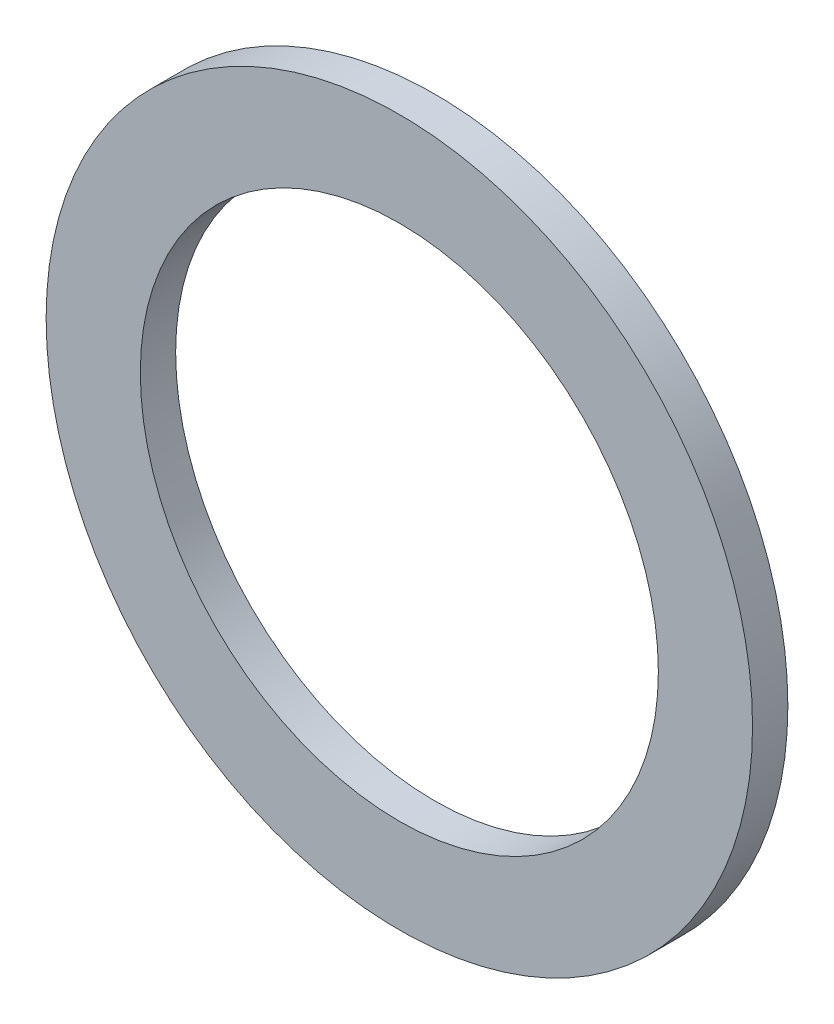
ISO-10303-21;
HEADER;
FILE_DESCRIPTION(('STEP AP214'),'2;1');
FILE_NAME('part.step','',(''),(''),'','','');
FILE_SCHEMA(('AUTOMOTIVE_DESIGN { 1 0 10303 214 1 1 1 1 }'));
ENDSEC;
DATA;
#1=APPLICATION_CONTEXT('core data for automotive mechanical design processes');
#2=APPLICATION_PROTOCOL_DEFINITION('international standard','automotive_design',2000,#1);
#3=PRODUCT_CONTEXT('',#1,'mechanical');
#4=PRODUCT('Part','Part','',(#3));
#5=PRODUCT_RELATED_PRODUCT_CATEGORY('part','',(#4));
#6=PRODUCT_DEFINITION_FORMATION('','',#4);
#7=PRODUCT_DEFINITION_CONTEXT('part definition',#1,'design');
#8=PRODUCT_DEFINITION('design','',#6,#7);
#9=PRODUCT_DEFINITION_SHAPE('','',#8);
#10=(LENGTH_UNIT() NAMED_UNIT(*) SI_UNIT(.MILLI.,.METRE.));
#11=(NAMED_UNIT(*) PLANE_ANGLE_UNIT() SI_UNIT($,.RADIAN.));
#12=(NAMED_UNIT(*) SI_UNIT($,.STERADIAN.) SOLID_ANGLE_UNIT());
#13=UNCERTAINTY_MEASURE_WITH_UNIT(LENGTH_MEASURE(1.E-05),#10,'distance_accuracy_value','');
#14=(GEOMETRIC_REPRESENTATION_CONTEXT(3) GLOBAL_UNCERTAINTY_ASSIGNED_CONTEXT((#13)) GLOBAL_UNIT_ASSIGNED_CONTEXT((#10,
#11,#12)) REPRESENTATION_CONTEXT('',''));
#15=CARTESIAN_POINT('',(0.,0.,0.));
#16=DIRECTION('',(0.,0.,1.));
#17=DIRECTION('',(1.,0.,0.));
#18=AXIS2_PLACEMENT_3D('',#15,#16,#17);
#19=CARTESIAN_POINT('',(0.,0.,1.5));
#20=DIRECTION('',(0.,0.,1.));
#21=DIRECTION('',(1.,0.,0.));
#22=AXIS2_PLACEMENT_3D('',#19,#20,#21);
#23=PLANE('',#22);
#24=CARTESIAN_POINT('',(0.,0.,1.5));
#25=DIRECTION('',(0.,0.,1.));
#26=DIRECTION('',(1.,0.,0.));
#27=AXIS2_PLACEMENT_3D('',#24,#25,#26);
#28=CIRCLE('',#27,15.);
#29=CARTESIAN_POINT('',(15.,0.,1.5));
#30=VERTEX_POINT('',#29);
#31=EDGE_CURVE('E10',#30,#30,#28,.T.);
#32=ORIENTED_EDGE('',*,*,#31,.T.);
#33=EDGE_LOOP('',(#32));
#34=FACE_BOUND('',#33,.T.);
#35=CARTESIAN_POINT('',(0.,0.,1.5));
#36=DIRECTION('',(0.,0.,1.));
#37=DIRECTION('',(1.,0.,0.));
#38=AXIS2_PLACEMENT_3D('',#35,#36,#37);
#39=CIRCLE('',#38,11.);
#40=CARTESIAN_POINT('',(11.,0.,1.5));
#41=VERTEX_POINT('',#40);
#42=EDGE_CURVE('E56',#41,#41,#39,.T.);
#43=ORIENTED_EDGE('',*,*,#42,.F.);
#44=EDGE_LOOP('',(#43));
#45=FACE_BOUND('',#44,.T.);
#46=ADVANCED_FACE('F43',(#34,#45),#23,.T.);
#47=CARTESIAN_POINT('',(0.,0.,0.));
#48=DIRECTION('',(0.,0.,1.));
#49=DIRECTION('',(1.,0.,0.));
#50=AXIS2_PLACEMENT_3D('',#47,#48,#49);
#51=PLANE('',#50);
#52=CARTESIAN_POINT('',(0.,0.,0.));
#53=DIRECTION('',(0.,0.,1.));
#54=DIRECTION('',(1.,0.,0.));
#55=AXIS2_PLACEMENT_3D('',#52,#53,#54);
#56=CIRCLE('',#55,15.);
#57=CARTESIAN_POINT('',(15.,0.,0.));
#58=VERTEX_POINT('',#57);
#59=EDGE_CURVE('E47',#58,#58,#56,.T.);
#60=ORIENTED_EDGE('',*,*,#59,.F.);
#61=EDGE_LOOP('',(#60));
#62=FACE_BOUND('',#61,.T.);
#63=CARTESIAN_POINT('',(0.,0.,0.));
#64=DIRECTION('',(0.,0.,1.));
#65=DIRECTION('',(1.,0.,0.));
#66=AXIS2_PLACEMENT_3D('',#63,#64,#65);
#67=CIRCLE('',#66,11.);
#68=CARTESIAN_POINT('',(11.,0.,0.));
#69=VERTEX_POINT('',#68);
#70=EDGE_CURVE('E58',#69,#69,#67,.T.);
#71=ORIENTED_EDGE('',*,*,#70,.T.);
#72=EDGE_LOOP('',(#71));
#73=FACE_BOUND('',#72,.T.);
#74=ADVANCED_FACE('F70',(#62,#73),#51,.F.);
#75=CARTESIAN_POINT('',(0.,0.,1.5));
#76=DIRECTION('',(0.,0.,-1.));
#77=DIRECTION('',(-1.,0.,0.));
#78=AXIS2_PLACEMENT_3D('',#75,#76,#77);
#79=CYLINDRICAL_SURFACE('',#78,15.);
#80=ORIENTED_EDGE('',*,*,#31,.F.);
#81=EDGE_LOOP('',(#80));
#82=FACE_BOUND('',#81,.T.);
#83=ORIENTED_EDGE('',*,*,#59,.T.);
#84=EDGE_LOOP('',(#83));
#85=FACE_BOUND('',#84,.T.);
#86=ADVANCED_FACE('F45',(#82,#85),#79,.T.);
#87=CARTESIAN_POINT('',(0.,0.,1.5));
#88=DIRECTION('',(0.,0.,-1.));
#89=DIRECTION('',(-1.,0.,0.));
#90=AXIS2_PLACEMENT_3D('',#87,#88,#89);
#91=CYLINDRICAL_SURFACE('',#90,11.);
#92=ORIENTED_EDGE('',*,*,#42,.T.);
#93=EDGE_LOOP('',(#92));
#94=FACE_BOUND('',#93,.T.);
#95=ORIENTED_EDGE('',*,*,#70,.F.);
#96=EDGE_LOOP('',(#95));
#97=FACE_BOUND('',#96,.T.);
#98=ADVANCED_FACE('F66',(#94,#97),#91,.F.);
#99=CLOSED_SHELL('',(#46,#74,#86,#98));
#100=MANIFOLD_SOLID_BREP('B2',#99);
#101=ADVANCED_BREP_SHAPE_REPRESENTATION('',(#18,#100),#14);
#102=SHAPE_DEFINITION_REPRESENTATION(#9,#101);
ENDSEC;
END-ISO-10303-21;
